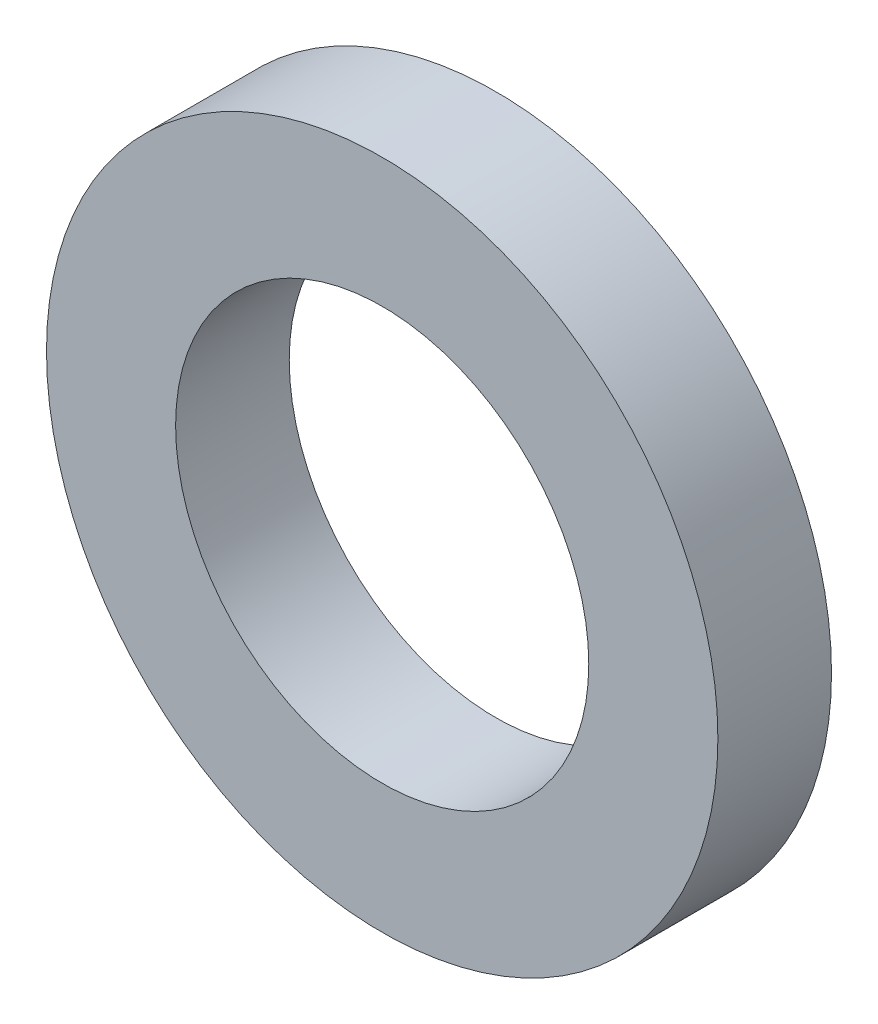
ISO-10303-21;
HEADER;
FILE_DESCRIPTION(('STEP AP214'),'2;1');
FILE_NAME('part.step','',(''),(''),'','','');
FILE_SCHEMA(('AUTOMOTIVE_DESIGN { 1 0 10303 214 1 1 1 1 }'));
ENDSEC;
DATA;
#1=APPLICATION_CONTEXT('core data for automotive mechanical design processes');
#2=APPLICATION_PROTOCOL_DEFINITION('international standard','automotive_design',2000,#1);
#3=PRODUCT_CONTEXT('',#1,'mechanical');
#4=PRODUCT('Part','Part','',(#3));
#5=PRODUCT_RELATED_PRODUCT_CATEGORY('part','',(#4));
#6=PRODUCT_DEFINITION_FORMATION('','',#4);
#7=PRODUCT_DEFINITION_CONTEXT('part definition',#1,'design');
#8=PRODUCT_DEFINITION('design','',#6,#7);
#9=PRODUCT_DEFINITION_SHAPE('','',#8);
#10=(LENGTH_UNIT() NAMED_UNIT(*) SI_UNIT(.MILLI.,.METRE.));
#11=(NAMED_UNIT(*) PLANE_ANGLE_UNIT() SI_UNIT($,.RADIAN.));
#12=(NAMED_UNIT(*) SI_UNIT($,.STERADIAN.) SOLID_ANGLE_UNIT());
#13=UNCERTAINTY_MEASURE_WITH_UNIT(LENGTH_MEASURE(1.E-05),#10,'distance_accuracy_value','');
#14=(GEOMETRIC_REPRESENTATION_CONTEXT(3) GLOBAL_UNCERTAINTY_ASSIGNED_CONTEXT((#13)) GLOBAL_UNIT_ASSIGNED_CONTEXT((#10,
#11,#12)) REPRESENTATION_CONTEXT('',''));
#15=CARTESIAN_POINT('',(0.,0.,0.));
#16=DIRECTION('',(0.,0.,1.));
#17=DIRECTION('',(1.,0.,0.));
#18=AXIS2_PLACEMENT_3D('',#15,#16,#17);
#19=CARTESIAN_POINT('',(0.,0.,1.1));
#20=DIRECTION('',(0.,0.,1.));
#21=DIRECTION('',(1.,0.,0.));
#22=AXIS2_PLACEMENT_3D('',#19,#20,#21);
#23=PLANE('',#22);
#24=CARTESIAN_POINT('',(0.,0.,1.1));
#25=DIRECTION('',(0.,0.,1.));
#26=DIRECTION('',(1.,0.,0.));
#27=AXIS2_PLACEMENT_3D('',#24,#25,#26);
#28=CIRCLE('',#27,3.25);
#29=CARTESIAN_POINT('',(3.25,0.,1.1));
#30=VERTEX_POINT('',#29);
#31=EDGE_CURVE('E10',#30,#30,#28,.T.);
#32=ORIENTED_EDGE('',*,*,#31,.T.);
#33=EDGE_LOOP('',(#32));
#34=FACE_BOUND('',#33,.T.);
#35=CARTESIAN_POINT('',(0.,0.,1.1));
#36=DIRECTION('',(0.,0.,1.));
#37=DIRECTION('',(1.,0.,0.));
#38=AXIS2_PLACEMENT_3D('',#35,#36,#37);
#39=CIRCLE('',#38,2.);
#40=CARTESIAN_POINT('',(2.,0.,1.1));
#41=VERTEX_POINT('',#40);
#42=EDGE_CURVE('E44',#41,#41,#39,.T.);
#43=ORIENTED_EDGE('',*,*,#42,.F.);
#44=EDGE_LOOP('',(#43));
#45=FACE_BOUND('',#44,.T.);
#46=ADVANCED_FACE('F33',(#34,#45),#23,.T.);
#47=CARTESIAN_POINT('',(0.,0.,0.));
#48=DIRECTION('',(0.,0.,1.));
#49=DIRECTION('',(1.,0.,0.));
#50=AXIS2_PLACEMENT_3D('',#47,#48,#49);
#51=PLANE('',#50);
#52=CARTESIAN_POINT('',(0.,0.,0.));
#53=DIRECTION('',(0.,0.,1.));
#54=DIRECTION('',(1.,0.,0.));
#55=AXIS2_PLACEMENT_3D('',#52,#53,#54);
#56=CIRCLE('',#55,3.25);
#57=CARTESIAN_POINT('',(3.25,0.,0.));
#58=VERTEX_POINT('',#57);
#59=EDGE_CURVE('E37',#58,#58,#56,.T.);
#60=ORIENTED_EDGE('',*,*,#59,.F.);
#61=EDGE_LOOP('',(#60));
#62=FACE_BOUND('',#61,.T.);
#63=CARTESIAN_POINT('',(0.,0.,0.));
#64=DIRECTION('',(0.,0.,1.));
#65=DIRECTION('',(1.,0.,0.));
#66=AXIS2_PLACEMENT_3D('',#63,#64,#65);
#67=CIRCLE('',#66,2.);
#68=CARTESIAN_POINT('',(2.,0.,0.));
#69=VERTEX_POINT('',#68);
#70=EDGE_CURVE('E46',#69,#69,#67,.T.);
#71=ORIENTED_EDGE('',*,*,#70,.T.);
#72=EDGE_LOOP('',(#71));
#73=FACE_BOUND('',#72,.T.);
#74=ADVANCED_FACE('F56',(#62,#73),#51,.F.);
#75=CARTESIAN_POINT('',(0.,0.,1.1));
#76=DIRECTION('',(0.,0.,-1.));
#77=DIRECTION('',(-1.,0.,0.));
#78=AXIS2_PLACEMENT_3D('',#75,#76,#77);
#79=CYLINDRICAL_SURFACE('',#78,3.25);
#80=ORIENTED_EDGE('',*,*,#31,.F.);
#81=EDGE_LOOP('',(#80));
#82=FACE_BOUND('',#81,.T.);
#83=ORIENTED_EDGE('',*,*,#59,.T.);
#84=EDGE_LOOP('',(#83));
#85=FACE_BOUND('',#84,.T.);
#86=ADVANCED_FACE('F35',(#82,#85),#79,.T.);
#87=CARTESIAN_POINT('',(0.,0.,1.1));
#88=DIRECTION('',(0.,0.,-1.));
#89=DIRECTION('',(-1.,0.,0.));
#90=AXIS2_PLACEMENT_3D('',#87,#88,#89);
#91=CYLINDRICAL_SURFACE('',#90,2.);
#92=ORIENTED_EDGE('',*,*,#42,.T.);
#93=EDGE_LOOP('',(#92));
#94=FACE_BOUND('',#93,.T.);
#95=ORIENTED_EDGE('',*,*,#70,.F.);
#96=EDGE_LOOP('',(#95));
#97=FACE_BOUND('',#96,.T.);
#98=ADVANCED_FACE('F52',(#94,#97),#91,.F.);
#99=CLOSED_SHELL('',(#46,#74,#86,#98));
#100=MANIFOLD_SOLID_BREP('B2',#99);
#101=ADVANCED_BREP_SHAPE_REPRESENTATION('',(#18,#100),#14);
#102=SHAPE_DEFINITION_REPRESENTATION(#9,#101);
ENDSEC;
END-ISO-10303-21;
